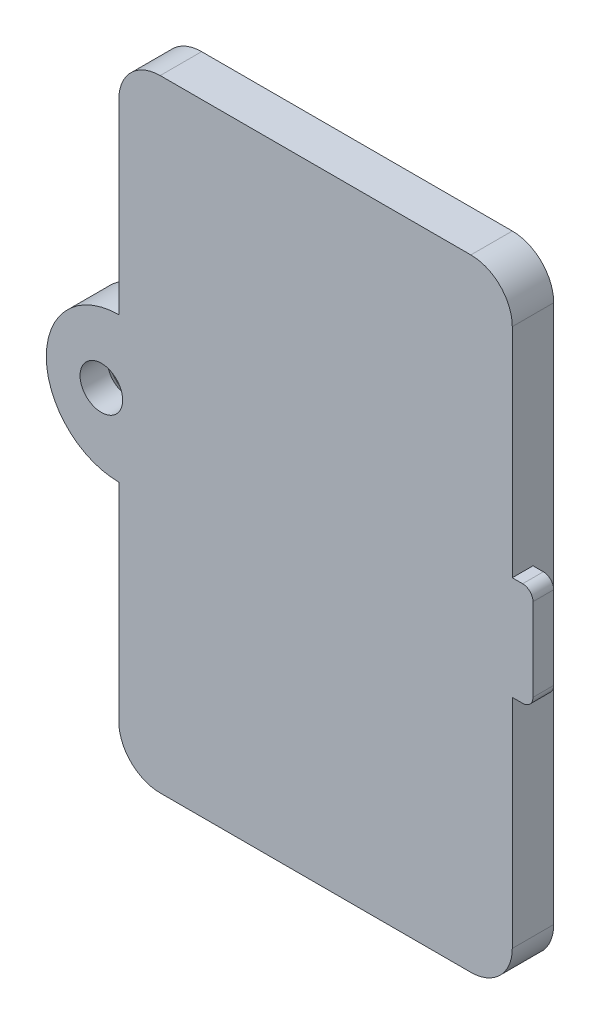
ISO-10303-21;
HEADER;
FILE_DESCRIPTION(('STEP AP214'),'2;1');
FILE_NAME('part.step','',(''),(''),'','','');
FILE_SCHEMA(('AUTOMOTIVE_DESIGN { 1 0 10303 214 1 1 1 1 }'));
ENDSEC;
DATA;
#1=APPLICATION_CONTEXT('core data for automotive mechanical design processes');
#2=APPLICATION_PROTOCOL_DEFINITION('international standard','automotive_design',2000,#1);
#3=PRODUCT_CONTEXT('',#1,'mechanical');
#4=PRODUCT('Part','Part','',(#3));
#5=PRODUCT_RELATED_PRODUCT_CATEGORY('part','',(#4));
#6=PRODUCT_DEFINITION_FORMATION('','',#4);
#7=PRODUCT_DEFINITION_CONTEXT('part definition',#1,'design');
#8=PRODUCT_DEFINITION('design','',#6,#7);
#9=PRODUCT_DEFINITION_SHAPE('','',#8);
#10=(LENGTH_UNIT() NAMED_UNIT(*) SI_UNIT(.MILLI.,.METRE.));
#11=(NAMED_UNIT(*) PLANE_ANGLE_UNIT() SI_UNIT($,.RADIAN.));
#12=(NAMED_UNIT(*) SI_UNIT($,.STERADIAN.) SOLID_ANGLE_UNIT());
#13=UNCERTAINTY_MEASURE_WITH_UNIT(LENGTH_MEASURE(1.E-05),#10,'distance_accuracy_value','');
#14=(GEOMETRIC_REPRESENTATION_CONTEXT(3) GLOBAL_UNCERTAINTY_ASSIGNED_CONTEXT((#13)) GLOBAL_UNIT_ASSIGNED_CONTEXT((#10,
#11,#12)) REPRESENTATION_CONTEXT('',''));
#15=CARTESIAN_POINT('',(0.,0.,0.));
#16=DIRECTION('',(0.,0.,1.));
#17=DIRECTION('',(1.,0.,0.));
#18=AXIS2_PLACEMENT_3D('',#15,#16,#17);
#19=CARTESIAN_POINT('',(-70.7651776285827,-32.09,-1.));
#20=DIRECTION('',(0.,0.,1.));
#21=DIRECTION('',(1.,0.,0.));
#22=AXIS2_PLACEMENT_3D('',#19,#20,#21);
#23=PLANE('',#22);
#24=DIRECTION('',(0.,-1.,0.));
#25=VECTOR('',#24,1.);
#26=CARTESIAN_POINT('',(-70.7651776285827,-17.59,-1.));
#27=LINE('',#26,#25);
#28=CARTESIAN_POINT('',(-70.7651776285827,-19.59,-1.));
#29=VERTEX_POINT('',#28);
#30=CARTESIAN_POINT('',(-70.7651776285827,-28.59,-1.));
#31=VERTEX_POINT('',#30);
#32=EDGE_CURVE('E207',#29,#31,#27,.T.);
#33=ORIENTED_EDGE('',*,*,#32,.F.);
#34=CARTESIAN_POINT('',(-68.7651776285827,-19.59,-1.));
#35=DIRECTION('',(0.,0.,1.));
#36=DIRECTION('',(1.,0.,0.));
#37=AXIS2_PLACEMENT_3D('',#34,#35,#36);
#38=CIRCLE('',#37,2.);
#39=CARTESIAN_POINT('',(-68.7651776285827,-17.59,-1.));
#40=VERTEX_POINT('',#39);
#41=EDGE_CURVE('E249',#29,#40,#38,.F.);
#42=ORIENTED_EDGE('',*,*,#41,.T.);
#43=DIRECTION('',(-1.,0.,0.));
#44=VECTOR('',#43,1.);
#45=CARTESIAN_POINT('',(-70.7651776285827,-17.59,-1.));
#46=LINE('',#45,#44);
#47=CARTESIAN_POINT('',(-53.7651776285827,-17.59,-1.));
#48=VERTEX_POINT('',#47);
#49=EDGE_CURVE('E220',#48,#40,#46,.T.);
#50=ORIENTED_EDGE('',*,*,#49,.F.);
#51=CARTESIAN_POINT('',(-53.7651776285827,-19.59,-1.));
#52=DIRECTION('',(0.,0.,1.));
#53=DIRECTION('',(1.,0.,0.));
#54=AXIS2_PLACEMENT_3D('',#51,#52,#53);
#55=CIRCLE('',#54,2.);
#56=CARTESIAN_POINT('',(-51.7651776285827,-19.59,-1.));
#57=VERTEX_POINT('',#56);
#58=EDGE_CURVE('E247',#48,#57,#55,.F.);
#59=ORIENTED_EDGE('',*,*,#58,.T.);
#60=DIRECTION('',(0.,1.,0.));
#61=VECTOR('',#60,1.);
#62=CARTESIAN_POINT('',(-51.7651776285827,-17.59,-1.));
#63=LINE('',#62,#61);
#64=CARTESIAN_POINT('',(-51.7651776285827,-45.59,-1.));
#65=VERTEX_POINT('',#64);
#66=EDGE_CURVE('E218',#65,#57,#63,.T.);
#67=ORIENTED_EDGE('',*,*,#66,.F.);
#68=CARTESIAN_POINT('',(-53.7651776285827,-45.59,-1.));
#69=DIRECTION('',(0.,0.,1.));
#70=DIRECTION('',(1.,0.,0.));
#71=AXIS2_PLACEMENT_3D('',#68,#69,#70);
#72=CIRCLE('',#71,2.);
#73=CARTESIAN_POINT('',(-53.7651776285827,-47.59,-1.));
#74=VERTEX_POINT('',#73);
#75=EDGE_CURVE('E245',#65,#74,#72,.F.);
#76=ORIENTED_EDGE('',*,*,#75,.T.);
#77=DIRECTION('',(1.,0.,0.));
#78=VECTOR('',#77,1.);
#79=CARTESIAN_POINT('',(-70.7651776285827,-47.59,-1.));
#80=LINE('',#79,#78);
#81=CARTESIAN_POINT('',(-68.7651776285826,-47.59,-1.));
#82=VERTEX_POINT('',#81);
#83=EDGE_CURVE('E215',#82,#74,#80,.T.);
#84=ORIENTED_EDGE('',*,*,#83,.F.);
#85=CARTESIAN_POINT('',(-68.7651776285826,-45.59,-1.));
#86=DIRECTION('',(0.,0.,1.));
#87=DIRECTION('',(1.,0.,0.));
#88=AXIS2_PLACEMENT_3D('',#85,#86,#87);
#89=CIRCLE('',#88,2.);
#90=CARTESIAN_POINT('',(-70.7651776285827,-45.59,-1.));
#91=VERTEX_POINT('',#90);
#92=EDGE_CURVE('E243',#82,#91,#89,.F.);
#93=ORIENTED_EDGE('',*,*,#92,.T.);
#94=DIRECTION('',(0.,-1.,0.));
#95=VECTOR('',#94,1.);
#96=CARTESIAN_POINT('',(-70.7651776285827,-47.59,-1.));
#97=LINE('',#96,#95);
#98=CARTESIAN_POINT('',(-70.7651776285827,-35.59,-1.));
#99=VERTEX_POINT('',#98);
#100=EDGE_CURVE('E212',#99,#91,#97,.T.);
#101=ORIENTED_EDGE('',*,*,#100,.F.);
#102=CARTESIAN_POINT('',(-70.7651776285827,-32.09,-1.));
#103=DIRECTION('',(0.,0.,1.));
#104=DIRECTION('',(1.,0.,0.));
#105=AXIS2_PLACEMENT_3D('',#102,#103,#104);
#106=CIRCLE('',#105,3.5);
#107=EDGE_CURVE('E209',#31,#99,#106,.T.);
#108=ORIENTED_EDGE('',*,*,#107,.F.);
#109=EDGE_LOOP('',(#33,#42,#50,#59,#67,#76,#84,#93,#101,#108));
#110=FACE_BOUND('',#109,.T.);
#111=CARTESIAN_POINT('',(-71.6064293639452,-32.0687460383444,-1.));
#112=DIRECTION('',(0.,0.,-1.));
#113=DIRECTION('',(-1.,0.,0.));
#114=AXIS2_PLACEMENT_3D('',#111,#112,#113);
#115=CIRCLE('',#114,1.8542);
#116=CARTESIAN_POINT('',(-73.4606293639452,-32.0687460383444,-1.));
#117=VERTEX_POINT('',#116);
#118=EDGE_CURVE('E369',#117,#117,#115,.T.);
#119=ORIENTED_EDGE('',*,*,#118,.F.);
#120=EDGE_LOOP('',(#119));
#121=FACE_BOUND('',#120,.T.);
#122=ADVANCED_FACE('F36',(#110,#121),#23,.F.);
#123=CARTESIAN_POINT('',(-70.7651776285827,-17.59,-1.));
#124=DIRECTION('',(-1.,0.,0.));
#125=DIRECTION('',(0.,0.,1.));
#126=AXIS2_PLACEMENT_3D('',#123,#124,#125);
#127=PLANE('',#126);
#128=DIRECTION('',(0.,-1.,0.));
#129=VECTOR('',#128,1.);
#130=CARTESIAN_POINT('',(-70.7651776285827,-17.59,1.));
#131=LINE('',#130,#129);
#132=CARTESIAN_POINT('',(-70.7651776285827,-19.59,1.));
#133=VERTEX_POINT('',#132);
#134=CARTESIAN_POINT('',(-70.7651776285827,-28.59,1.));
#135=VERTEX_POINT('',#134);
#136=EDGE_CURVE('E189',#133,#135,#131,.T.);
#137=ORIENTED_EDGE('',*,*,#136,.F.);
#138=DIRECTION('',(0.,0.,1.));
#139=VECTOR('',#138,1.);
#140=CARTESIAN_POINT('',(-70.7651776285827,-19.59,-1.));
#141=LINE('',#140,#139);
#142=EDGE_CURVE('E241',#133,#29,#141,.F.);
#143=ORIENTED_EDGE('',*,*,#142,.T.);
#144=ORIENTED_EDGE('',*,*,#32,.T.);
#145=DIRECTION('',(0.,0.,1.));
#146=VECTOR('',#145,1.);
#147=CARTESIAN_POINT('',(-70.7651776285827,-28.59,-1.));
#148=LINE('',#147,#146);
#149=EDGE_CURVE('E223',#31,#135,#148,.T.);
#150=ORIENTED_EDGE('',*,*,#149,.T.);
#151=EDGE_LOOP('',(#137,#143,#144,#150));
#152=FACE_BOUND('',#151,.T.);
#153=ADVANCED_FACE('F327',(#152),#127,.T.);
#154=CARTESIAN_POINT('',(-70.7651776285827,-17.59,-1.));
#155=DIRECTION('',(0.,1.,0.));
#156=DIRECTION('',(0.,0.,1.));
#157=AXIS2_PLACEMENT_3D('',#154,#155,#156);
#158=PLANE('',#157);
#159=ORIENTED_EDGE('',*,*,#49,.T.);
#160=DIRECTION('',(0.,0.,1.));
#161=VECTOR('',#160,1.);
#162=CARTESIAN_POINT('',(-68.7651776285827,-17.59,-1.));
#163=LINE('',#162,#161);
#164=CARTESIAN_POINT('',(-68.7651776285827,-17.59,1.));
#165=VERTEX_POINT('',#164);
#166=EDGE_CURVE('E230',#40,#165,#163,.T.);
#167=ORIENTED_EDGE('',*,*,#166,.T.);
#168=DIRECTION('',(-1.,0.,0.));
#169=VECTOR('',#168,1.);
#170=CARTESIAN_POINT('',(-70.7651776285827,-17.59,1.));
#171=LINE('',#170,#169);
#172=CARTESIAN_POINT('',(-53.7651776285827,-17.59,1.));
#173=VERTEX_POINT('',#172);
#174=EDGE_CURVE('E204',#173,#165,#171,.T.);
#175=ORIENTED_EDGE('',*,*,#174,.F.);
#176=DIRECTION('',(0.,0.,1.));
#177=VECTOR('',#176,1.);
#178=CARTESIAN_POINT('',(-53.7651776285827,-17.59,-1.));
#179=LINE('',#178,#177);
#180=EDGE_CURVE('E226',#173,#48,#179,.F.);
#181=ORIENTED_EDGE('',*,*,#180,.T.);
#182=EDGE_LOOP('',(#159,#167,#175,#181));
#183=FACE_BOUND('',#182,.T.);
#184=ADVANCED_FACE('F292',(#183),#158,.T.);
#185=CARTESIAN_POINT('',(-51.7651776285827,-17.59,-1.));
#186=DIRECTION('',(1.,0.,0.));
#187=DIRECTION('',(0.,1.,0.));
#188=AXIS2_PLACEMENT_3D('',#185,#186,#187);
#189=PLANE('',#188);
#190=ORIENTED_EDGE('',*,*,#66,.T.);
#191=DIRECTION('',(0.,0.,1.));
#192=VECTOR('',#191,1.);
#193=CARTESIAN_POINT('',(-51.7651776285827,-19.59,-1.));
#194=LINE('',#193,#192);
#195=CARTESIAN_POINT('',(-51.7651776285827,-19.59,1.));
#196=VERTEX_POINT('',#195);
#197=EDGE_CURVE('E253',#57,#196,#194,.T.);
#198=ORIENTED_EDGE('',*,*,#197,.T.);
#199=DIRECTION('',(0.,1.,0.));
#200=VECTOR('',#199,1.);
#201=CARTESIAN_POINT('',(-51.7651776285827,-17.59,1.));
#202=LINE('',#201,#200);
#203=CARTESIAN_POINT('',(-51.7651776285827,-30.09,1.));
#204=VERTEX_POINT('',#203);
#205=EDGE_CURVE('E201',#204,#196,#202,.T.);
#206=ORIENTED_EDGE('',*,*,#205,.F.);
#207=DIRECTION('',(0.,0.,1.));
#208=VECTOR('',#207,1.);
#209=CARTESIAN_POINT('',(-51.7651776285827,-30.09,0.));
#210=LINE('',#209,#208);
#211=CARTESIAN_POINT('',(-51.7651776285827,-30.09,0.));
#212=VERTEX_POINT('',#211);
#213=EDGE_CURVE('E162',#212,#204,#210,.T.);
#214=ORIENTED_EDGE('',*,*,#213,.F.);
#215=DIRECTION('',(0.,-1.,0.));
#216=VECTOR('',#215,1.);
#217=CARTESIAN_POINT('',(-51.7651776285827,-30.09,0.));
#218=LINE('',#217,#216);
#219=CARTESIAN_POINT('',(-51.7651776285827,-35.09,0.));
#220=VERTEX_POINT('',#219);
#221=EDGE_CURVE('E167',#212,#220,#218,.T.);
#222=ORIENTED_EDGE('',*,*,#221,.T.);
#223=DIRECTION('',(0.,0.,1.));
#224=VECTOR('',#223,1.);
#225=CARTESIAN_POINT('',(-51.7651776285827,-35.09,0.));
#226=LINE('',#225,#224);
#227=CARTESIAN_POINT('',(-51.7651776285827,-35.09,1.));
#228=VERTEX_POINT('',#227);
#229=EDGE_CURVE('E153',#220,#228,#226,.T.);
#230=ORIENTED_EDGE('',*,*,#229,.T.);
#231=CARTESIAN_POINT('',(-51.7651776285827,-45.59,1.));
#232=VERTEX_POINT('',#231);
#233=EDGE_CURVE('E202',#232,#228,#202,.T.);
#234=ORIENTED_EDGE('',*,*,#233,.F.);
#235=DIRECTION('',(0.,0.,1.));
#236=VECTOR('',#235,1.);
#237=CARTESIAN_POINT('',(-51.7651776285827,-45.59,-1.));
#238=LINE('',#237,#236);
#239=EDGE_CURVE('E251',#232,#65,#238,.F.);
#240=ORIENTED_EDGE('',*,*,#239,.T.);
#241=EDGE_LOOP('',(#190,#198,#206,#214,#222,#230,#234,#240));
#242=FACE_BOUND('',#241,.T.);
#243=ADVANCED_FACE('F172',(#242),#189,.T.);
#244=CARTESIAN_POINT('',(-70.7651776285827,-47.59,-1.));
#245=DIRECTION('',(0.,-1.,0.));
#246=DIRECTION('',(1.,0.,0.));
#247=AXIS2_PLACEMENT_3D('',#244,#245,#246);
#248=PLANE('',#247);
#249=ORIENTED_EDGE('',*,*,#83,.T.);
#250=DIRECTION('',(0.,0.,1.));
#251=VECTOR('',#250,1.);
#252=CARTESIAN_POINT('',(-53.7651776285827,-47.59,-1.));
#253=LINE('',#252,#251);
#254=CARTESIAN_POINT('',(-53.7651776285827,-47.59,1.));
#255=VERTEX_POINT('',#254);
#256=EDGE_CURVE('E258',#74,#255,#253,.T.);
#257=ORIENTED_EDGE('',*,*,#256,.T.);
#258=DIRECTION('',(1.,0.,0.));
#259=VECTOR('',#258,1.);
#260=CARTESIAN_POINT('',(-70.7651776285827,-47.59,1.));
#261=LINE('',#260,#259);
#262=CARTESIAN_POINT('',(-68.7651776285826,-47.59,1.));
#263=VERTEX_POINT('',#262);
#264=EDGE_CURVE('E198',#263,#255,#261,.T.);
#265=ORIENTED_EDGE('',*,*,#264,.F.);
#266=DIRECTION('',(0.,0.,1.));
#267=VECTOR('',#266,1.);
#268=CARTESIAN_POINT('',(-68.7651776285826,-47.59,-1.));
#269=LINE('',#268,#267);
#270=EDGE_CURVE('E256',#263,#82,#269,.F.);
#271=ORIENTED_EDGE('',*,*,#270,.T.);
#272=EDGE_LOOP('',(#249,#257,#265,#271));
#273=FACE_BOUND('',#272,.T.);
#274=ADVANCED_FACE('F309',(#273),#248,.T.);
#275=CARTESIAN_POINT('',(-70.7651776285827,-47.59,-1.));
#276=DIRECTION('',(-1.,0.,0.));
#277=DIRECTION('',(0.,-1.,0.));
#278=AXIS2_PLACEMENT_3D('',#275,#276,#277);
#279=PLANE('',#278);
#280=ORIENTED_EDGE('',*,*,#100,.T.);
#281=DIRECTION('',(0.,0.,1.));
#282=VECTOR('',#281,1.);
#283=CARTESIAN_POINT('',(-70.7651776285827,-45.59,-1.));
#284=LINE('',#283,#282);
#285=CARTESIAN_POINT('',(-70.7651776285827,-45.59,1.));
#286=VERTEX_POINT('',#285);
#287=EDGE_CURVE('E261',#91,#286,#284,.T.);
#288=ORIENTED_EDGE('',*,*,#287,.T.);
#289=DIRECTION('',(0.,-1.,0.));
#290=VECTOR('',#289,1.);
#291=CARTESIAN_POINT('',(-70.7651776285827,-47.59,1.));
#292=LINE('',#291,#290);
#293=CARTESIAN_POINT('',(-70.7651776285827,-35.59,1.));
#294=VERTEX_POINT('',#293);
#295=EDGE_CURVE('E195',#294,#286,#292,.T.);
#296=ORIENTED_EDGE('',*,*,#295,.F.);
#297=DIRECTION('',(0.,0.,1.));
#298=VECTOR('',#297,1.);
#299=CARTESIAN_POINT('',(-70.7651776285827,-35.59,-1.));
#300=LINE('',#299,#298);
#301=EDGE_CURVE('E224',#99,#294,#300,.T.);
#302=ORIENTED_EDGE('',*,*,#301,.F.);
#303=EDGE_LOOP('',(#280,#288,#296,#302));
#304=FACE_BOUND('',#303,.T.);
#305=ADVANCED_FACE('F318',(#304),#279,.T.);
#306=CARTESIAN_POINT('',(-70.7651776285827,-32.09,-1.));
#307=DIRECTION('',(0.,0.,1.));
#308=DIRECTION('',(1.,0.,0.));
#309=AXIS2_PLACEMENT_3D('',#306,#307,#308);
#310=CYLINDRICAL_SURFACE('',#309,3.5);
#311=ORIENTED_EDGE('',*,*,#301,.T.);
#312=CARTESIAN_POINT('',(-70.7651776285827,-32.09,1.));
#313=DIRECTION('',(0.,0.,1.));
#314=DIRECTION('',(1.,0.,0.));
#315=AXIS2_PLACEMENT_3D('',#312,#313,#314);
#316=CIRCLE('',#315,3.5);
#317=EDGE_CURVE('E192',#135,#294,#316,.T.);
#318=ORIENTED_EDGE('',*,*,#317,.F.);
#319=ORIENTED_EDGE('',*,*,#149,.F.);
#320=ORIENTED_EDGE('',*,*,#107,.T.);
#321=EDGE_LOOP('',(#311,#318,#319,#320));
#322=FACE_BOUND('',#321,.T.);
#323=ADVANCED_FACE('F322',(#322),#310,.T.);
#324=CARTESIAN_POINT('',(-70.7651776285827,-32.09,1.));
#325=DIRECTION('',(0.,0.,1.));
#326=DIRECTION('',(1.,0.,0.));
#327=AXIS2_PLACEMENT_3D('',#324,#325,#326);
#328=PLANE('',#327);
#329=CARTESIAN_POINT('',(-71.6064293639452,-32.0687460383444,1.));
#330=DIRECTION('',(0.,0.,1.));
#331=DIRECTION('',(1.,0.,0.));
#332=AXIS2_PLACEMENT_3D('',#329,#330,#331);
#333=CIRCLE('',#332,1.02869999999999);
#334=CARTESIAN_POINT('',(-70.5777293639452,-32.0687460383444,1.));
#335=VERTEX_POINT('',#334);
#336=EDGE_CURVE('E40',#335,#335,#333,.T.);
#337=ORIENTED_EDGE('',*,*,#336,.F.);
#338=EDGE_LOOP('',(#337));
#339=FACE_BOUND('',#338,.T.);
#340=DIRECTION('',(0.,1.,0.));
#341=VECTOR('',#340,1.);
#342=CARTESIAN_POINT('',(-50.7651776285827,-30.09,1.));
#343=LINE('',#342,#341);
#344=CARTESIAN_POINT('',(-50.7651776285827,-34.59,1.));
#345=VERTEX_POINT('',#344);
#346=CARTESIAN_POINT('',(-50.7651776285827,-30.59,1.));
#347=VERTEX_POINT('',#346);
#348=EDGE_CURVE('E177',#345,#347,#343,.T.);
#349=ORIENTED_EDGE('',*,*,#348,.T.);
#350=CARTESIAN_POINT('',(-51.2651776285827,-30.59,1.));
#351=DIRECTION('',(0.,0.,1.));
#352=DIRECTION('',(1.,0.,0.));
#353=AXIS2_PLACEMENT_3D('',#350,#351,#352);
#354=CIRCLE('',#353,0.5);
#355=CARTESIAN_POINT('',(-51.2651776285826,-30.09,1.));
#356=VERTEX_POINT('',#355);
#357=EDGE_CURVE('E271',#347,#356,#354,.T.);
#358=ORIENTED_EDGE('',*,*,#357,.T.);
#359=DIRECTION('',(-1.,0.,0.));
#360=VECTOR('',#359,1.);
#361=CARTESIAN_POINT('',(-51.7651776285827,-30.09,1.));
#362=LINE('',#361,#360);
#363=EDGE_CURVE('E175',#356,#204,#362,.T.);
#364=ORIENTED_EDGE('',*,*,#363,.T.);
#365=ORIENTED_EDGE('',*,*,#205,.T.);
#366=CARTESIAN_POINT('',(-53.7651776285827,-19.59,1.));
#367=DIRECTION('',(0.,0.,1.));
#368=DIRECTION('',(1.,0.,0.));
#369=AXIS2_PLACEMENT_3D('',#366,#367,#368);
#370=CIRCLE('',#369,2.);
#371=EDGE_CURVE('E237',#196,#173,#370,.T.);
#372=ORIENTED_EDGE('',*,*,#371,.T.);
#373=ORIENTED_EDGE('',*,*,#174,.T.);
#374=CARTESIAN_POINT('',(-68.7651776285827,-19.59,1.));
#375=DIRECTION('',(0.,0.,1.));
#376=DIRECTION('',(1.,0.,0.));
#377=AXIS2_PLACEMENT_3D('',#374,#375,#376);
#378=CIRCLE('',#377,2.);
#379=EDGE_CURVE('E239',#165,#133,#378,.T.);
#380=ORIENTED_EDGE('',*,*,#379,.T.);
#381=ORIENTED_EDGE('',*,*,#136,.T.);
#382=ORIENTED_EDGE('',*,*,#317,.T.);
#383=ORIENTED_EDGE('',*,*,#295,.T.);
#384=CARTESIAN_POINT('',(-68.7651776285826,-45.59,1.));
#385=DIRECTION('',(0.,0.,1.));
#386=DIRECTION('',(1.,0.,0.));
#387=AXIS2_PLACEMENT_3D('',#384,#385,#386);
#388=CIRCLE('',#387,2.);
#389=EDGE_CURVE('E233',#286,#263,#388,.T.);
#390=ORIENTED_EDGE('',*,*,#389,.T.);
#391=ORIENTED_EDGE('',*,*,#264,.T.);
#392=CARTESIAN_POINT('',(-53.7651776285827,-45.59,1.));
#393=DIRECTION('',(0.,0.,1.));
#394=DIRECTION('',(1.,0.,0.));
#395=AXIS2_PLACEMENT_3D('',#392,#393,#394);
#396=CIRCLE('',#395,2.);
#397=EDGE_CURVE('E235',#255,#232,#396,.T.);
#398=ORIENTED_EDGE('',*,*,#397,.T.);
#399=ORIENTED_EDGE('',*,*,#233,.T.);
#400=DIRECTION('',(1.,0.,0.));
#401=VECTOR('',#400,1.);
#402=CARTESIAN_POINT('',(-51.7651776285827,-35.09,1.));
#403=LINE('',#402,#401);
#404=CARTESIAN_POINT('',(-51.2651776285827,-35.09,1.));
#405=VERTEX_POINT('',#404);
#406=EDGE_CURVE('E158',#228,#405,#403,.T.);
#407=ORIENTED_EDGE('',*,*,#406,.T.);
#408=CARTESIAN_POINT('',(-51.2651776285827,-34.59,1.));
#409=DIRECTION('',(0.,0.,1.));
#410=DIRECTION('',(1.,0.,0.));
#411=AXIS2_PLACEMENT_3D('',#408,#409,#410);
#412=CIRCLE('',#411,0.5);
#413=EDGE_CURVE('E269',#405,#345,#412,.T.);
#414=ORIENTED_EDGE('',*,*,#413,.T.);
#415=EDGE_LOOP('',(#349,#358,#364,#365,#372,#373,#380,#381,#382,#383,#390,#391,#398,#399,#407,#414));
#416=FACE_BOUND('',#415,.T.);
#417=ADVANCED_FACE('F284',(#339,#416),#328,.T.);
#418=CARTESIAN_POINT('',(-51.7651776285827,-30.09,0.));
#419=DIRECTION('',(0.,1.,0.));
#420=DIRECTION('',(-1.,0.,0.));
#421=AXIS2_PLACEMENT_3D('',#418,#419,#420);
#422=PLANE('',#421);
#423=ORIENTED_EDGE('',*,*,#363,.F.);
#424=DIRECTION('',(0.,0.,1.));
#425=VECTOR('',#424,1.);
#426=CARTESIAN_POINT('',(-51.2651776285826,-30.09,0.));
#427=LINE('',#426,#425);
#428=CARTESIAN_POINT('',(-51.2651776285826,-30.09,0.));
#429=VERTEX_POINT('',#428);
#430=EDGE_CURVE('E60',#356,#429,#427,.F.);
#431=ORIENTED_EDGE('',*,*,#430,.T.);
#432=DIRECTION('',(-1.,0.,0.));
#433=VECTOR('',#432,1.);
#434=CARTESIAN_POINT('',(-51.7651776285827,-30.09,0.));
#435=LINE('',#434,#433);
#436=EDGE_CURVE('E163',#429,#212,#435,.T.);
#437=ORIENTED_EDGE('',*,*,#436,.T.);
#438=ORIENTED_EDGE('',*,*,#213,.T.);
#439=EDGE_LOOP('',(#423,#431,#437,#438));
#440=FACE_BOUND('',#439,.T.);
#441=ADVANCED_FACE('F286',(#440),#422,.T.);
#442=CARTESIAN_POINT('',(-50.7651776285827,-30.09,0.));
#443=DIRECTION('',(1.,0.,0.));
#444=DIRECTION('',(0.,0.,-1.));
#445=AXIS2_PLACEMENT_3D('',#442,#443,#444);
#446=PLANE('',#445);
#447=DIRECTION('',(0.,1.,0.));
#448=VECTOR('',#447,1.);
#449=CARTESIAN_POINT('',(-50.7651776285827,-30.09,0.));
#450=LINE('',#449,#448);
#451=CARTESIAN_POINT('',(-50.7651776285827,-34.59,0.));
#452=VERTEX_POINT('',#451);
#453=CARTESIAN_POINT('',(-50.7651776285827,-30.59,0.));
#454=VERTEX_POINT('',#453);
#455=EDGE_CURVE('E169',#452,#454,#450,.T.);
#456=ORIENTED_EDGE('',*,*,#455,.T.);
#457=DIRECTION('',(0.,0.,1.));
#458=VECTOR('',#457,1.);
#459=CARTESIAN_POINT('',(-50.7651776285827,-30.59,0.));
#460=LINE('',#459,#458);
#461=EDGE_CURVE('E266',#454,#347,#460,.T.);
#462=ORIENTED_EDGE('',*,*,#461,.T.);
#463=ORIENTED_EDGE('',*,*,#348,.F.);
#464=DIRECTION('',(0.,0.,1.));
#465=VECTOR('',#464,1.);
#466=CARTESIAN_POINT('',(-50.7651776285827,-34.59,0.));
#467=LINE('',#466,#465);
#468=EDGE_CURVE('E264',#345,#452,#467,.F.);
#469=ORIENTED_EDGE('',*,*,#468,.T.);
#470=EDGE_LOOP('',(#456,#462,#463,#469));
#471=FACE_BOUND('',#470,.T.);
#472=ADVANCED_FACE('F279',(#471),#446,.T.);
#473=CARTESIAN_POINT('',(-51.7651776285827,-35.09,0.));
#474=DIRECTION('',(0.,-1.,0.));
#475=DIRECTION('',(0.,0.,-1.));
#476=AXIS2_PLACEMENT_3D('',#473,#474,#475);
#477=PLANE('',#476);
#478=DIRECTION('',(1.,0.,0.));
#479=VECTOR('',#478,1.);
#480=CARTESIAN_POINT('',(-51.7651776285827,-35.09,0.));
#481=LINE('',#480,#479);
#482=CARTESIAN_POINT('',(-51.2651776285827,-35.09,0.));
#483=VERTEX_POINT('',#482);
#484=EDGE_CURVE('E155',#220,#483,#481,.T.);
#485=ORIENTED_EDGE('',*,*,#484,.T.);
#486=DIRECTION('',(0.,0.,1.));
#487=VECTOR('',#486,1.);
#488=CARTESIAN_POINT('',(-51.2651776285827,-35.09,0.));
#489=LINE('',#488,#487);
#490=EDGE_CURVE('E11',#483,#405,#489,.T.);
#491=ORIENTED_EDGE('',*,*,#490,.T.);
#492=ORIENTED_EDGE('',*,*,#406,.F.);
#493=ORIENTED_EDGE('',*,*,#229,.F.);
#494=EDGE_LOOP('',(#485,#491,#492,#493));
#495=FACE_BOUND('',#494,.T.);
#496=ADVANCED_FACE('F154',(#495),#477,.T.);
#497=CARTESIAN_POINT('',(0.,0.,0.));
#498=DIRECTION('',(0.,0.,1.));
#499=DIRECTION('',(1.,0.,0.));
#500=AXIS2_PLACEMENT_3D('',#497,#498,#499);
#501=PLANE('',#500);
#502=ORIENTED_EDGE('',*,*,#436,.F.);
#503=CARTESIAN_POINT('',(-51.2651776285827,-30.59,0.));
#504=DIRECTION('',(0.,0.,1.));
#505=DIRECTION('',(1.,0.,0.));
#506=AXIS2_PLACEMENT_3D('',#503,#504,#505);
#507=CIRCLE('',#506,0.5);
#508=EDGE_CURVE('E45',#429,#454,#507,.F.);
#509=ORIENTED_EDGE('',*,*,#508,.T.);
#510=ORIENTED_EDGE('',*,*,#455,.F.);
#511=CARTESIAN_POINT('',(-51.2651776285827,-34.59,0.));
#512=DIRECTION('',(0.,0.,1.));
#513=DIRECTION('',(1.,0.,0.));
#514=AXIS2_PLACEMENT_3D('',#511,#512,#513);
#515=CIRCLE('',#514,0.5);
#516=EDGE_CURVE('E52',#452,#483,#515,.F.);
#517=ORIENTED_EDGE('',*,*,#516,.T.);
#518=ORIENTED_EDGE('',*,*,#484,.F.);
#519=ORIENTED_EDGE('',*,*,#221,.F.);
#520=EDGE_LOOP('',(#502,#509,#510,#517,#518,#519));
#521=FACE_BOUND('',#520,.T.);
#522=ADVANCED_FACE('F166',(#521),#501,.F.);
#523=CARTESIAN_POINT('',(-68.7651776285827,-19.59,-1.));
#524=DIRECTION('',(0.,0.,1.));
#525=DIRECTION('',(1.,0.,0.));
#526=AXIS2_PLACEMENT_3D('',#523,#524,#525);
#527=CYLINDRICAL_SURFACE('',#526,2.);
#528=ORIENTED_EDGE('',*,*,#41,.F.);
#529=ORIENTED_EDGE('',*,*,#142,.F.);
#530=ORIENTED_EDGE('',*,*,#379,.F.);
#531=ORIENTED_EDGE('',*,*,#166,.F.);
#532=EDGE_LOOP('',(#528,#529,#530,#531));
#533=FACE_BOUND('',#532,.T.);
#534=ADVANCED_FACE('F330',(#533),#527,.T.);
#535=CARTESIAN_POINT('',(-53.7651776285827,-19.59,-1.));
#536=DIRECTION('',(0.,0.,1.));
#537=DIRECTION('',(1.,0.,0.));
#538=AXIS2_PLACEMENT_3D('',#535,#536,#537);
#539=CYLINDRICAL_SURFACE('',#538,2.);
#540=ORIENTED_EDGE('',*,*,#58,.F.);
#541=ORIENTED_EDGE('',*,*,#180,.F.);
#542=ORIENTED_EDGE('',*,*,#371,.F.);
#543=ORIENTED_EDGE('',*,*,#197,.F.);
#544=EDGE_LOOP('',(#540,#541,#542,#543));
#545=FACE_BOUND('',#544,.T.);
#546=ADVANCED_FACE('F296',(#545),#539,.T.);
#547=CARTESIAN_POINT('',(-53.7651776285827,-45.59,-1.));
#548=DIRECTION('',(0.,0.,1.));
#549=DIRECTION('',(1.,0.,0.));
#550=AXIS2_PLACEMENT_3D('',#547,#548,#549);
#551=CYLINDRICAL_SURFACE('',#550,2.);
#552=ORIENTED_EDGE('',*,*,#75,.F.);
#553=ORIENTED_EDGE('',*,*,#239,.F.);
#554=ORIENTED_EDGE('',*,*,#397,.F.);
#555=ORIENTED_EDGE('',*,*,#256,.F.);
#556=EDGE_LOOP('',(#552,#553,#554,#555));
#557=FACE_BOUND('',#556,.T.);
#558=ADVANCED_FACE('F304',(#557),#551,.T.);
#559=CARTESIAN_POINT('',(-68.7651776285826,-45.59,-1.));
#560=DIRECTION('',(0.,0.,1.));
#561=DIRECTION('',(1.,0.,0.));
#562=AXIS2_PLACEMENT_3D('',#559,#560,#561);
#563=CYLINDRICAL_SURFACE('',#562,2.);
#564=ORIENTED_EDGE('',*,*,#92,.F.);
#565=ORIENTED_EDGE('',*,*,#270,.F.);
#566=ORIENTED_EDGE('',*,*,#389,.F.);
#567=ORIENTED_EDGE('',*,*,#287,.F.);
#568=EDGE_LOOP('',(#564,#565,#566,#567));
#569=FACE_BOUND('',#568,.T.);
#570=ADVANCED_FACE('F313',(#569),#563,.T.);
#571=CARTESIAN_POINT('',(-51.2651776285827,-30.59,0.));
#572=DIRECTION('',(0.,0.,1.));
#573=DIRECTION('',(1.,0.,0.));
#574=AXIS2_PLACEMENT_3D('',#571,#572,#573);
#575=CYLINDRICAL_SURFACE('',#574,0.5);
#576=ORIENTED_EDGE('',*,*,#508,.F.);
#577=ORIENTED_EDGE('',*,*,#430,.F.);
#578=ORIENTED_EDGE('',*,*,#357,.F.);
#579=ORIENTED_EDGE('',*,*,#461,.F.);
#580=EDGE_LOOP('',(#576,#577,#578,#579));
#581=FACE_BOUND('',#580,.T.);
#582=ADVANCED_FACE('F282',(#581),#575,.T.);
#583=CARTESIAN_POINT('',(-51.2651776285827,-34.59,0.));
#584=DIRECTION('',(0.,0.,1.));
#585=DIRECTION('',(1.,0.,0.));
#586=AXIS2_PLACEMENT_3D('',#583,#584,#585);
#587=CYLINDRICAL_SURFACE('',#586,0.5);
#588=ORIENTED_EDGE('',*,*,#516,.F.);
#589=ORIENTED_EDGE('',*,*,#468,.F.);
#590=ORIENTED_EDGE('',*,*,#413,.F.);
#591=ORIENTED_EDGE('',*,*,#490,.F.);
#592=EDGE_LOOP('',(#588,#589,#590,#591));
#593=FACE_BOUND('',#592,.T.);
#594=ADVANCED_FACE('F38',(#593),#587,.T.);
#595=CARTESIAN_POINT('',(-71.6064293639452,-32.0687460383444,-1.));
#596=DIRECTION('',(0.,0.,-1.));
#597=DIRECTION('',(-1.,0.,0.));
#598=AXIS2_PLACEMENT_3D('',#595,#596,#597);
#599=CYLINDRICAL_SURFACE('',#598,1.02869999999999);
#600=ORIENTED_EDGE('',*,*,#336,.T.);
#601=EDGE_LOOP('',(#600));
#602=FACE_BOUND('',#601,.T.);
#603=CARTESIAN_POINT('',(-71.6064293639452,-32.0687460383444,-0.307323254463128));
#604=DIRECTION('',(0.,0.,-1.));
#605=DIRECTION('',(-1.,0.,0.));
#606=AXIS2_PLACEMENT_3D('',#603,#604,#605);
#607=CIRCLE('',#606,1.02869999999999);
#608=CARTESIAN_POINT('',(-72.6351293639452,-32.0687460383444,-0.307323254463128));
#609=VERTEX_POINT('',#608);
#610=EDGE_CURVE('E180',#609,#609,#607,.T.);
#611=ORIENTED_EDGE('',*,*,#610,.T.);
#612=EDGE_LOOP('',(#611));
#613=FACE_BOUND('',#612,.T.);
#614=ADVANCED_FACE('F377',(#602,#613),#599,.F.);
#615=CARTESIAN_POINT('',(-71.6064293639452,-32.0687460383444,-1.));
#616=DIRECTION('',(0.,0.,-1.));
#617=DIRECTION('',(-1.,0.,0.));
#618=AXIS2_PLACEMENT_3D('',#615,#616,#617);
#619=CONICAL_SURFACE('',#618,1.8542,0.872664625997148);
#620=ORIENTED_EDGE('',*,*,#610,.F.);
#621=EDGE_LOOP('',(#620));
#622=FACE_BOUND('',#621,.T.);
#623=ORIENTED_EDGE('',*,*,#118,.T.);
#624=EDGE_LOOP('',(#623));
#625=FACE_BOUND('',#624,.T.);
#626=ADVANCED_FACE('F375',(#622,#625),#619,.F.);
#627=CLOSED_SHELL('',(#122,#153,#184,#243,#274,#305,#323,#417,#441,#472,#496,#522,#534,#546,
#558,#570,#582,#594,#614,#626));
#628=MANIFOLD_SOLID_BREP('B2',#627);
#629=ADVANCED_BREP_SHAPE_REPRESENTATION('',(#18,#628),#14);
#630=SHAPE_DEFINITION_REPRESENTATION(#9,#629);
ENDSEC;
END-ISO-10303-21;
